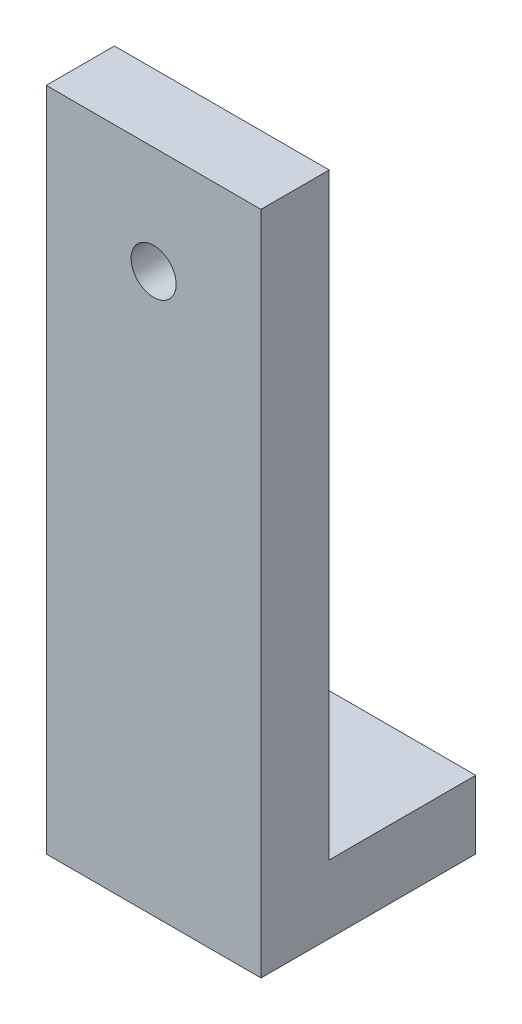
ISO-10303-21;
HEADER;
FILE_DESCRIPTION(('STEP AP214'),'2;1');
FILE_NAME('part.step','',(''),(''),'','','');
FILE_SCHEMA(('AUTOMOTIVE_DESIGN { 1 0 10303 214 1 1 1 1 }'));
ENDSEC;
DATA;
#1=APPLICATION_CONTEXT('core data for automotive mechanical design processes');
#2=APPLICATION_PROTOCOL_DEFINITION('international standard','automotive_design',2000,#1);
#3=PRODUCT_CONTEXT('',#1,'mechanical');
#4=PRODUCT('Part','Part','',(#3));
#5=PRODUCT_RELATED_PRODUCT_CATEGORY('part','',(#4));
#6=PRODUCT_DEFINITION_FORMATION('','',#4);
#7=PRODUCT_DEFINITION_CONTEXT('part definition',#1,'design');
#8=PRODUCT_DEFINITION('design','',#6,#7);
#9=PRODUCT_DEFINITION_SHAPE('','',#8);
#10=(LENGTH_UNIT() NAMED_UNIT(*) SI_UNIT(.MILLI.,.METRE.));
#11=(NAMED_UNIT(*) PLANE_ANGLE_UNIT() SI_UNIT($,.RADIAN.));
#12=(NAMED_UNIT(*) SI_UNIT($,.STERADIAN.) SOLID_ANGLE_UNIT());
#13=UNCERTAINTY_MEASURE_WITH_UNIT(LENGTH_MEASURE(1.E-05),#10,'distance_accuracy_value','');
#14=(GEOMETRIC_REPRESENTATION_CONTEXT(3) GLOBAL_UNCERTAINTY_ASSIGNED_CONTEXT((#13)) GLOBAL_UNIT_ASSIGNED_CONTEXT((#10,
#11,#12)) REPRESENTATION_CONTEXT('',''));
#15=CARTESIAN_POINT('',(0.,0.,0.));
#16=DIRECTION('',(0.,0.,1.));
#17=DIRECTION('',(1.,0.,0.));
#18=AXIS2_PLACEMENT_3D('',#15,#16,#17);
#19=CARTESIAN_POINT('',(20.,0.,-20.));
#20=DIRECTION('',(0.,1.,0.));
#21=DIRECTION('',(0.,0.,1.));
#22=AXIS2_PLACEMENT_3D('',#19,#20,#21);
#23=PLANE('',#22);
#24=DIRECTION('',(0.,0.,-1.));
#25=VECTOR('',#24,1.);
#26=CARTESIAN_POINT('',(0.,0.,-20.));
#27=LINE('',#26,#25);
#28=CARTESIAN_POINT('',(0.,0.,0.));
#29=VERTEX_POINT('',#28);
#30=CARTESIAN_POINT('',(0.,0.,-20.));
#31=VERTEX_POINT('',#30);
#32=EDGE_CURVE('E115',#29,#31,#27,.T.);
#33=ORIENTED_EDGE('',*,*,#32,.T.);
#34=DIRECTION('',(-1.,0.,0.));
#35=VECTOR('',#34,1.);
#36=CARTESIAN_POINT('',(20.,0.,-20.));
#37=LINE('',#36,#35);
#38=CARTESIAN_POINT('',(20.,0.,-20.));
#39=VERTEX_POINT('',#38);
#40=EDGE_CURVE('E11',#39,#31,#37,.T.);
#41=ORIENTED_EDGE('',*,*,#40,.F.);
#42=DIRECTION('',(0.,0.,-1.));
#43=VECTOR('',#42,1.);
#44=CARTESIAN_POINT('',(20.,0.,-20.));
#45=LINE('',#44,#43);
#46=CARTESIAN_POINT('',(20.,0.,0.));
#47=VERTEX_POINT('',#46);
#48=EDGE_CURVE('E126',#47,#39,#45,.T.);
#49=ORIENTED_EDGE('',*,*,#48,.F.);
#50=DIRECTION('',(-1.,0.,0.));
#51=VECTOR('',#50,1.);
#52=CARTESIAN_POINT('',(20.,0.,0.));
#53=LINE('',#52,#51);
#54=EDGE_CURVE('E111',#47,#29,#53,.T.);
#55=ORIENTED_EDGE('',*,*,#54,.T.);
#56=EDGE_LOOP('',(#33,#41,#49,#55));
#57=FACE_BOUND('',#56,.T.);
#58=ADVANCED_FACE('F31',(#57),#23,.F.);
#59=CARTESIAN_POINT('',(20.,6.35,-20.));
#60=DIRECTION('',(0.,0.,1.));
#61=DIRECTION('',(1.,0.,0.));
#62=AXIS2_PLACEMENT_3D('',#59,#60,#61);
#63=PLANE('',#62);
#64=DIRECTION('',(0.,1.,0.));
#65=VECTOR('',#64,1.);
#66=CARTESIAN_POINT('',(0.,6.35,-20.));
#67=LINE('',#66,#65);
#68=CARTESIAN_POINT('',(0.,6.35,-20.));
#69=VERTEX_POINT('',#68);
#70=EDGE_CURVE('E118',#31,#69,#67,.T.);
#71=ORIENTED_EDGE('',*,*,#70,.T.);
#72=DIRECTION('',(-1.,0.,0.));
#73=VECTOR('',#72,1.);
#74=CARTESIAN_POINT('',(20.,6.35,-20.));
#75=LINE('',#74,#73);
#76=CARTESIAN_POINT('',(20.,6.35,-20.));
#77=VERTEX_POINT('',#76);
#78=EDGE_CURVE('E39',#77,#69,#75,.T.);
#79=ORIENTED_EDGE('',*,*,#78,.F.);
#80=DIRECTION('',(0.,1.,0.));
#81=VECTOR('',#80,1.);
#82=CARTESIAN_POINT('',(20.,6.35,-20.));
#83=LINE('',#82,#81);
#84=EDGE_CURVE('E84',#39,#77,#83,.T.);
#85=ORIENTED_EDGE('',*,*,#84,.F.);
#86=ORIENTED_EDGE('',*,*,#40,.T.);
#87=EDGE_LOOP('',(#71,#79,#85,#86));
#88=FACE_BOUND('',#87,.T.);
#89=ADVANCED_FACE('F152',(#88),#63,.F.);
#90=CARTESIAN_POINT('',(20.,6.35,-6.35));
#91=DIRECTION('',(0.,-1.,0.));
#92=DIRECTION('',(0.,0.,-1.));
#93=AXIS2_PLACEMENT_3D('',#90,#91,#92);
#94=PLANE('',#93);
#95=DIRECTION('',(0.,0.,1.));
#96=VECTOR('',#95,1.);
#97=CARTESIAN_POINT('',(0.,6.35,-6.35));
#98=LINE('',#97,#96);
#99=CARTESIAN_POINT('',(0.,6.35,-6.35));
#100=VERTEX_POINT('',#99);
#101=EDGE_CURVE('E121',#69,#100,#98,.T.);
#102=ORIENTED_EDGE('',*,*,#101,.T.);
#103=DIRECTION('',(-1.,0.,0.));
#104=VECTOR('',#103,1.);
#105=CARTESIAN_POINT('',(20.,6.35,-6.35));
#106=LINE('',#105,#104);
#107=CARTESIAN_POINT('',(20.,6.35,-6.35));
#108=VERTEX_POINT('',#107);
#109=EDGE_CURVE('E106',#108,#100,#106,.T.);
#110=ORIENTED_EDGE('',*,*,#109,.F.);
#111=DIRECTION('',(0.,0.,1.));
#112=VECTOR('',#111,1.);
#113=CARTESIAN_POINT('',(20.,6.35,-6.35));
#114=LINE('',#113,#112);
#115=EDGE_CURVE('E97',#77,#108,#114,.T.);
#116=ORIENTED_EDGE('',*,*,#115,.F.);
#117=ORIENTED_EDGE('',*,*,#78,.T.);
#118=EDGE_LOOP('',(#102,#110,#116,#117));
#119=FACE_BOUND('',#118,.T.);
#120=ADVANCED_FACE('F132',(#119),#94,.F.);
#121=CARTESIAN_POINT('',(20.,62.,-6.35));
#122=DIRECTION('',(0.,0.,1.));
#123=DIRECTION('',(0.,-1.,0.));
#124=AXIS2_PLACEMENT_3D('',#121,#122,#123);
#125=PLANE('',#124);
#126=CARTESIAN_POINT('',(9.99999999999999,52.,-6.35));
#127=DIRECTION('',(0.,0.,1.));
#128=DIRECTION('',(0.,-1.,0.));
#129=AXIS2_PLACEMENT_3D('',#126,#127,#128);
#130=CIRCLE('',#129,2.09999999999999);
#131=CARTESIAN_POINT('',(9.99999999999999,49.9,-6.35));
#132=VERTEX_POINT('',#131);
#133=EDGE_CURVE('E119',#132,#132,#130,.T.);
#134=ORIENTED_EDGE('',*,*,#133,.T.);
#135=EDGE_LOOP('',(#134));
#136=FACE_BOUND('',#135,.T.);
#137=DIRECTION('',(0.,1.,0.));
#138=VECTOR('',#137,1.);
#139=CARTESIAN_POINT('',(0.,62.,-6.35));
#140=LINE('',#139,#138);
#141=CARTESIAN_POINT('',(0.,62.,-6.35));
#142=VERTEX_POINT('',#141);
#143=EDGE_CURVE('E105',#100,#142,#140,.T.);
#144=ORIENTED_EDGE('',*,*,#143,.T.);
#145=DIRECTION('',(-1.,0.,0.));
#146=VECTOR('',#145,1.);
#147=CARTESIAN_POINT('',(20.,62.,-6.35));
#148=LINE('',#147,#146);
#149=CARTESIAN_POINT('',(20.,62.,-6.35));
#150=VERTEX_POINT('',#149);
#151=EDGE_CURVE('E102',#150,#142,#148,.T.);
#152=ORIENTED_EDGE('',*,*,#151,.F.);
#153=DIRECTION('',(0.,1.,0.));
#154=VECTOR('',#153,1.);
#155=CARTESIAN_POINT('',(20.,62.,-6.35));
#156=LINE('',#155,#154);
#157=EDGE_CURVE('E91',#108,#150,#156,.T.);
#158=ORIENTED_EDGE('',*,*,#157,.F.);
#159=ORIENTED_EDGE('',*,*,#109,.T.);
#160=EDGE_LOOP('',(#144,#152,#158,#159));
#161=FACE_BOUND('',#160,.T.);
#162=ADVANCED_FACE('F103',(#136,#161),#125,.F.);
#163=CARTESIAN_POINT('',(20.,62.,0.));
#164=DIRECTION('',(0.,-1.,0.));
#165=DIRECTION('',(0.,0.,-1.));
#166=AXIS2_PLACEMENT_3D('',#163,#164,#165);
#167=PLANE('',#166);
#168=DIRECTION('',(0.,0.,1.));
#169=VECTOR('',#168,1.);
#170=CARTESIAN_POINT('',(0.,62.,0.));
#171=LINE('',#170,#169);
#172=CARTESIAN_POINT('',(0.,62.,0.));
#173=VERTEX_POINT('',#172);
#174=EDGE_CURVE('E70',#142,#173,#171,.T.);
#175=ORIENTED_EDGE('',*,*,#174,.T.);
#176=DIRECTION('',(-1.,0.,0.));
#177=VECTOR('',#176,1.);
#178=CARTESIAN_POINT('',(20.,62.,0.));
#179=LINE('',#178,#177);
#180=CARTESIAN_POINT('',(20.,62.,0.));
#181=VERTEX_POINT('',#180);
#182=EDGE_CURVE('E107',#181,#173,#179,.T.);
#183=ORIENTED_EDGE('',*,*,#182,.F.);
#184=DIRECTION('',(0.,0.,1.));
#185=VECTOR('',#184,1.);
#186=CARTESIAN_POINT('',(20.,62.,0.));
#187=LINE('',#186,#185);
#188=EDGE_CURVE('E95',#150,#181,#187,.T.);
#189=ORIENTED_EDGE('',*,*,#188,.F.);
#190=ORIENTED_EDGE('',*,*,#151,.T.);
#191=EDGE_LOOP('',(#175,#183,#189,#190));
#192=FACE_BOUND('',#191,.T.);
#193=ADVANCED_FACE('F109',(#192),#167,.F.);
#194=CARTESIAN_POINT('',(20.,0.,0.));
#195=DIRECTION('',(0.,0.,-1.));
#196=DIRECTION('',(-1.,0.,0.));
#197=AXIS2_PLACEMENT_3D('',#194,#195,#196);
#198=PLANE('',#197);
#199=CARTESIAN_POINT('',(9.99999999999999,52.,0.));
#200=DIRECTION('',(0.,0.,1.));
#201=DIRECTION('',(1.,0.,0.));
#202=AXIS2_PLACEMENT_3D('',#199,#200,#201);
#203=CIRCLE('',#202,2.09999999999999);
#204=CARTESIAN_POINT('',(12.1,52.,0.));
#205=VERTEX_POINT('',#204);
#206=EDGE_CURVE('E168',#205,#205,#203,.T.);
#207=ORIENTED_EDGE('',*,*,#206,.F.);
#208=EDGE_LOOP('',(#207));
#209=FACE_BOUND('',#208,.T.);
#210=DIRECTION('',(0.,-1.,0.));
#211=VECTOR('',#210,1.);
#212=CARTESIAN_POINT('',(0.,0.,0.));
#213=LINE('',#212,#211);
#214=EDGE_CURVE('E76',#173,#29,#213,.T.);
#215=ORIENTED_EDGE('',*,*,#214,.T.);
#216=ORIENTED_EDGE('',*,*,#54,.F.);
#217=DIRECTION('',(0.,-1.,0.));
#218=VECTOR('',#217,1.);
#219=CARTESIAN_POINT('',(20.,0.,0.));
#220=LINE('',#219,#218);
#221=EDGE_CURVE('E47',#181,#47,#220,.T.);
#222=ORIENTED_EDGE('',*,*,#221,.F.);
#223=ORIENTED_EDGE('',*,*,#182,.T.);
#224=EDGE_LOOP('',(#215,#216,#222,#223));
#225=FACE_BOUND('',#224,.T.);
#226=ADVANCED_FACE('F139',(#209,#225),#198,.F.);
#227=CARTESIAN_POINT('',(20.,0.,0.));
#228=DIRECTION('',(-1.,0.,0.));
#229=DIRECTION('',(0.,0.,1.));
#230=AXIS2_PLACEMENT_3D('',#227,#228,#229);
#231=PLANE('',#230);
#232=ORIENTED_EDGE('',*,*,#48,.T.);
#233=ORIENTED_EDGE('',*,*,#84,.T.);
#234=ORIENTED_EDGE('',*,*,#115,.T.);
#235=ORIENTED_EDGE('',*,*,#157,.T.);
#236=ORIENTED_EDGE('',*,*,#188,.T.);
#237=ORIENTED_EDGE('',*,*,#221,.T.);
#238=EDGE_LOOP('',(#232,#233,#234,#235,#236,#237));
#239=FACE_BOUND('',#238,.T.);
#240=ADVANCED_FACE('F93',(#239),#231,.F.);
#241=CARTESIAN_POINT('',(0.,0.,0.));
#242=DIRECTION('',(-1.,0.,0.));
#243=DIRECTION('',(0.,0.,1.));
#244=AXIS2_PLACEMENT_3D('',#241,#242,#243);
#245=PLANE('',#244);
#246=ORIENTED_EDGE('',*,*,#32,.F.);
#247=ORIENTED_EDGE('',*,*,#214,.F.);
#248=ORIENTED_EDGE('',*,*,#174,.F.);
#249=ORIENTED_EDGE('',*,*,#143,.F.);
#250=ORIENTED_EDGE('',*,*,#101,.F.);
#251=ORIENTED_EDGE('',*,*,#70,.F.);
#252=EDGE_LOOP('',(#246,#247,#248,#249,#250,#251));
#253=FACE_BOUND('',#252,.T.);
#254=ADVANCED_FACE('F135',(#253),#245,.T.);
#255=CARTESIAN_POINT('',(9.99999999999999,52.,0.));
#256=DIRECTION('',(0.,0.,1.));
#257=DIRECTION('',(1.,0.,0.));
#258=AXIS2_PLACEMENT_3D('',#255,#256,#257);
#259=CYLINDRICAL_SURFACE('',#258,2.09999999999999);
#260=ORIENTED_EDGE('',*,*,#206,.T.);
#261=EDGE_LOOP('',(#260));
#262=FACE_BOUND('',#261,.T.);
#263=ORIENTED_EDGE('',*,*,#133,.F.);
#264=EDGE_LOOP('',(#263));
#265=FACE_BOUND('',#264,.T.);
#266=ADVANCED_FACE('F175',(#262,#265),#259,.F.);
#267=CLOSED_SHELL('',(#58,#89,#120,#162,#193,#226,#240,#254,#266));
#268=MANIFOLD_SOLID_BREP('B2',#267);
#269=ADVANCED_BREP_SHAPE_REPRESENTATION('',(#18,#268),#14);
#270=SHAPE_DEFINITION_REPRESENTATION(#9,#269);
ENDSEC;
END-ISO-10303-21;
